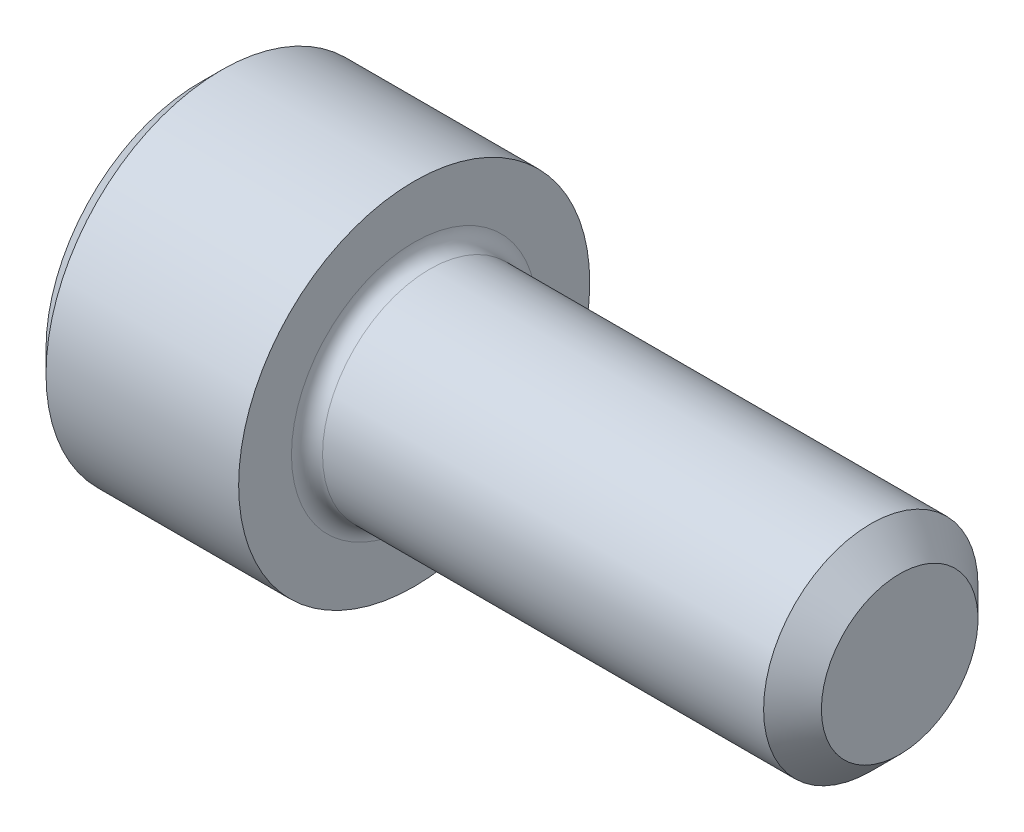
ISO-10303-21;
HEADER;
FILE_DESCRIPTION(('STEP AP214'),'2;1');
FILE_NAME('part.step','',(''),(''),'','','');
FILE_SCHEMA(('AUTOMOTIVE_DESIGN { 1 0 10303 214 1 1 1 1 }'));
ENDSEC;
DATA;
#1=APPLICATION_CONTEXT('core data for automotive mechanical design processes');
#2=APPLICATION_PROTOCOL_DEFINITION('international standard','automotive_design',2000,#1);
#3=PRODUCT_CONTEXT('',#1,'mechanical');
#4=PRODUCT('Part','Part','',(#3));
#5=PRODUCT_RELATED_PRODUCT_CATEGORY('part','',(#4));
#6=PRODUCT_DEFINITION_FORMATION('','',#4);
#7=PRODUCT_DEFINITION_CONTEXT('part definition',#1,'design');
#8=PRODUCT_DEFINITION('design','',#6,#7);
#9=PRODUCT_DEFINITION_SHAPE('','',#8);
#10=(LENGTH_UNIT() NAMED_UNIT(*) SI_UNIT(.MILLI.,.METRE.));
#11=(NAMED_UNIT(*) PLANE_ANGLE_UNIT() SI_UNIT($,.RADIAN.));
#12=(NAMED_UNIT(*) SI_UNIT($,.STERADIAN.) SOLID_ANGLE_UNIT());
#13=UNCERTAINTY_MEASURE_WITH_UNIT(LENGTH_MEASURE(1.E-05),#10,'distance_accuracy_value','');
#14=(GEOMETRIC_REPRESENTATION_CONTEXT(3) GLOBAL_UNCERTAINTY_ASSIGNED_CONTEXT((#13)) GLOBAL_UNIT_ASSIGNED_CONTEXT((#10,
#11,#12)) REPRESENTATION_CONTEXT('',''));
#15=CARTESIAN_POINT('',(0.,0.,0.));
#16=DIRECTION('',(0.,0.,1.));
#17=DIRECTION('',(1.,0.,0.));
#18=AXIS2_PLACEMENT_3D('',#15,#16,#17);
#19=CARTESIAN_POINT('',(0.,0.,0.));
#20=DIRECTION('',(-1.,0.,0.));
#21=DIRECTION('',(0.,0.,1.));
#22=AXIS2_PLACEMENT_3D('',#19,#20,#21);
#23=PLANE('',#22);
#24=DIRECTION('',(0.,-0.499999999999999,0.866025403784439));
#25=VECTOR('',#24,1.);
#26=CARTESIAN_POINT('',(0.,1.5984519552784,0.));
#27=LINE('',#26,#25);
#28=CARTESIAN_POINT('',(0.,1.5984519552784,0.));
#29=VERTEX_POINT('',#28);
#30=CARTESIAN_POINT('',(0.,0.799225977639205,1.3843));
#31=VERTEX_POINT('',#30);
#32=EDGE_CURVE('E257',#29,#31,#27,.T.);
#33=ORIENTED_EDGE('',*,*,#32,.T.);
#34=DIRECTION('',(0.,1.,0.));
#35=VECTOR('',#34,1.);
#36=CARTESIAN_POINT('',(0.,-0.799225977639191,1.3843));
#37=LINE('',#36,#35);
#38=CARTESIAN_POINT('',(0.,-0.799225977639191,1.3843));
#39=VERTEX_POINT('',#38);
#40=EDGE_CURVE('E128',#39,#31,#37,.T.);
#41=ORIENTED_EDGE('',*,*,#40,.F.);
#42=DIRECTION('',(0.,-0.500000000000001,-0.866025403784438));
#43=VECTOR('',#42,1.);
#44=CARTESIAN_POINT('',(0.,-0.799225977639191,1.3843));
#45=LINE('',#44,#43);
#46=CARTESIAN_POINT('',(0.,-1.59845195527839,0.));
#47=VERTEX_POINT('',#46);
#48=EDGE_CURVE('E260',#39,#47,#45,.T.);
#49=ORIENTED_EDGE('',*,*,#48,.T.);
#50=DIRECTION('',(0.,0.499999999999999,-0.86602540378444));
#51=VECTOR('',#50,1.);
#52=CARTESIAN_POINT('',(0.,-1.59845195527839,0.));
#53=LINE('',#52,#51);
#54=CARTESIAN_POINT('',(0.,-0.799225977639196,-1.3843));
#55=VERTEX_POINT('',#54);
#56=EDGE_CURVE('E263',#47,#55,#53,.T.);
#57=ORIENTED_EDGE('',*,*,#56,.T.);
#58=DIRECTION('',(0.,-1.,0.));
#59=VECTOR('',#58,1.);
#60=CARTESIAN_POINT('',(0.,0.799225977639202,-1.3843));
#61=LINE('',#60,#59);
#62=CARTESIAN_POINT('',(0.,0.799225977639202,-1.3843));
#63=VERTEX_POINT('',#62);
#64=EDGE_CURVE('E266',#63,#55,#61,.T.);
#65=ORIENTED_EDGE('',*,*,#64,.F.);
#66=DIRECTION('',(0.,-0.500000000000001,-0.866025403784438));
#67=VECTOR('',#66,1.);
#68=CARTESIAN_POINT('',(0.,1.5984519552784,0.));
#69=LINE('',#68,#67);
#70=EDGE_CURVE('E123',#29,#63,#69,.T.);
#71=ORIENTED_EDGE('',*,*,#70,.F.);
#72=EDGE_LOOP('',(#33,#41,#49,#57,#65,#71));
#73=FACE_BOUND('',#72,.T.);
#74=CARTESIAN_POINT('',(0.,0.,0.));
#75=DIRECTION('',(-1.,0.,0.));
#76=DIRECTION('',(0.,0.,1.));
#77=AXIS2_PLACEMENT_3D('',#74,#75,#76);
#78=CIRCLE('',#77,2.51460000000001);
#79=CARTESIAN_POINT('',(0.,0.,2.51460000000001));
#80=VERTEX_POINT('',#79);
#81=EDGE_CURVE('E152',#80,#80,#78,.T.);
#82=ORIENTED_EDGE('',*,*,#81,.T.);
#83=EDGE_LOOP('',(#82));
#84=FACE_BOUND('',#83,.T.);
#85=ADVANCED_FACE('F32',(#73,#84),#23,.T.);
#86=CARTESIAN_POINT('',(0.,0.,0.));
#87=DIRECTION('',(1.,0.,0.));
#88=DIRECTION('',(0.,0.,-1.));
#89=AXIS2_PLACEMENT_3D('',#86,#87,#88);
#90=CONICAL_SURFACE('',#89,2.51460000000001,0.785398163397436);
#91=CARTESIAN_POINT('',(0.355600000000005,0.,0.));
#92=DIRECTION('',(-1.,0.,0.));
#93=DIRECTION('',(0.,0.,1.));
#94=AXIS2_PLACEMENT_3D('',#91,#92,#93);
#95=CIRCLE('',#94,2.8702);
#96=CARTESIAN_POINT('',(0.355600000000005,0.,2.8702));
#97=VERTEX_POINT('',#96);
#98=EDGE_CURVE('E149',#97,#97,#95,.T.);
#99=ORIENTED_EDGE('',*,*,#98,.T.);
#100=EDGE_LOOP('',(#99));
#101=FACE_BOUND('',#100,.T.);
#102=ORIENTED_EDGE('',*,*,#81,.F.);
#103=EDGE_LOOP('',(#102));
#104=FACE_BOUND('',#103,.T.);
#105=ADVANCED_FACE('F173',(#101,#104),#90,.T.);
#106=CARTESIAN_POINT('',(-31.75,0.,0.));
#107=DIRECTION('',(-1.,0.,0.));
#108=DIRECTION('',(0.,0.,1.));
#109=AXIS2_PLACEMENT_3D('',#106,#107,#108);
#110=CYLINDRICAL_SURFACE('',#109,2.8702);
#111=CARTESIAN_POINT('',(3.5052,0.,0.));
#112=DIRECTION('',(-1.,0.,0.));
#113=DIRECTION('',(0.,0.,1.));
#114=AXIS2_PLACEMENT_3D('',#111,#112,#113);
#115=CIRCLE('',#114,2.8702);
#116=CARTESIAN_POINT('',(3.5052,0.,2.8702));
#117=VERTEX_POINT('',#116);
#118=EDGE_CURVE('E146',#117,#117,#115,.T.);
#119=ORIENTED_EDGE('',*,*,#118,.T.);
#120=EDGE_LOOP('',(#119));
#121=FACE_BOUND('',#120,.T.);
#122=ORIENTED_EDGE('',*,*,#98,.F.);
#123=EDGE_LOOP('',(#122));
#124=FACE_BOUND('',#123,.T.);
#125=ADVANCED_FACE('F178',(#121,#124),#110,.T.);
#126=CARTESIAN_POINT('',(3.5052,2.8702,0.));
#127=DIRECTION('',(1.,0.,0.));
#128=DIRECTION('',(0.,0.,-1.));
#129=AXIS2_PLACEMENT_3D('',#126,#127,#128);
#130=PLANE('',#129);
#131=CARTESIAN_POINT('',(3.5052,0.,0.));
#132=DIRECTION('',(1.,0.,0.));
#133=DIRECTION('',(0.,0.,-1.));
#134=AXIS2_PLACEMENT_3D('',#131,#132,#133);
#135=CIRCLE('',#134,2.0066);
#136=CARTESIAN_POINT('',(3.5052,0.,-2.0066));
#137=VERTEX_POINT('',#136);
#138=EDGE_CURVE('E40',#137,#137,#135,.F.);
#139=ORIENTED_EDGE('',*,*,#138,.T.);
#140=EDGE_LOOP('',(#139));
#141=FACE_BOUND('',#140,.T.);
#142=ORIENTED_EDGE('',*,*,#118,.F.);
#143=EDGE_LOOP('',(#142));
#144=FACE_BOUND('',#143,.T.);
#145=ADVANCED_FACE('F157',(#141,#144),#130,.T.);
#146=CARTESIAN_POINT('',(-31.75,0.,0.));
#147=DIRECTION('',(-1.,0.,0.));
#148=DIRECTION('',(0.,0.,1.));
#149=AXIS2_PLACEMENT_3D('',#146,#147,#148);
#150=CYLINDRICAL_SURFACE('',#149,1.7526);
#151=CARTESIAN_POINT('',(3.7592,0.,0.));
#152=DIRECTION('',(1.,0.,0.));
#153=DIRECTION('',(0.,0.,-1.));
#154=AXIS2_PLACEMENT_3D('',#151,#152,#153);
#155=CIRCLE('',#154,1.7526);
#156=CARTESIAN_POINT('',(3.7592,0.,-1.7526));
#157=VERTEX_POINT('',#156);
#158=EDGE_CURVE('E11',#157,#157,#155,.T.);
#159=ORIENTED_EDGE('',*,*,#158,.T.);
#160=EDGE_LOOP('',(#159));
#161=FACE_BOUND('',#160,.T.);
#162=CARTESIAN_POINT('',(10.97026,0.,0.));
#163=DIRECTION('',(-1.,0.,0.));
#164=DIRECTION('',(0.,0.,1.));
#165=AXIS2_PLACEMENT_3D('',#162,#163,#164);
#166=CIRCLE('',#165,1.7526);
#167=CARTESIAN_POINT('',(10.97026,0.,1.7526));
#168=VERTEX_POINT('',#167);
#169=EDGE_CURVE('E143',#168,#168,#166,.T.);
#170=ORIENTED_EDGE('',*,*,#169,.T.);
#171=EDGE_LOOP('',(#170));
#172=FACE_BOUND('',#171,.T.);
#173=ADVANCED_FACE('F188',(#161,#172),#150,.T.);
#174=CARTESIAN_POINT('',(11.4427,0.,0.));
#175=DIRECTION('',(-1.,0.,0.));
#176=DIRECTION('',(0.,0.,1.));
#177=AXIS2_PLACEMENT_3D('',#174,#175,#176);
#178=CONICAL_SURFACE('',#177,1.28016,0.785398163397457);
#179=ORIENTED_EDGE('',*,*,#169,.F.);
#180=EDGE_LOOP('',(#179));
#181=FACE_BOUND('',#180,.T.);
#182=CARTESIAN_POINT('',(11.4427,0.,0.));
#183=DIRECTION('',(-1.,0.,0.));
#184=DIRECTION('',(0.,0.,1.));
#185=AXIS2_PLACEMENT_3D('',#182,#183,#184);
#186=CIRCLE('',#185,1.28016);
#187=CARTESIAN_POINT('',(11.4427,0.,1.28016));
#188=VERTEX_POINT('',#187);
#189=EDGE_CURVE('E139',#188,#188,#186,.T.);
#190=ORIENTED_EDGE('',*,*,#189,.T.);
#191=EDGE_LOOP('',(#190));
#192=FACE_BOUND('',#191,.T.);
#193=ADVANCED_FACE('F168',(#181,#192),#178,.T.);
#194=CARTESIAN_POINT('',(11.4427,1.28016,0.));
#195=DIRECTION('',(1.,0.,0.));
#196=DIRECTION('',(0.,0.,-1.));
#197=AXIS2_PLACEMENT_3D('',#194,#195,#196);
#198=PLANE('',#197);
#199=ORIENTED_EDGE('',*,*,#189,.F.);
#200=EDGE_LOOP('',(#199));
#201=FACE_BOUND('',#200,.T.);
#202=ADVANCED_FACE('F161',(#201),#198,.T.);
#203=CARTESIAN_POINT('',(3.7592,0.,0.));
#204=DIRECTION('',(1.,0.,0.));
#205=DIRECTION('',(0.,0.,-1.));
#206=AXIS2_PLACEMENT_3D('',#203,#204,#205);
#207=TOROIDAL_SURFACE('',#206,2.0066,0.254);
#208=ORIENTED_EDGE('',*,*,#158,.F.);
#209=EDGE_LOOP('',(#208));
#210=FACE_BOUND('',#209,.T.);
#211=ORIENTED_EDGE('',*,*,#138,.F.);
#212=EDGE_LOOP('',(#211));
#213=FACE_BOUND('',#212,.T.);
#214=ADVANCED_FACE('F34',(#210,#213),#207,.F.);
#215=CARTESIAN_POINT('',(1.6256,1.5984519552784,0.));
#216=DIRECTION('',(0.,-0.866025403784439,-0.499999999999999));
#217=DIRECTION('',(0.,0.499999999999999,-0.866025403784439));
#218=AXIS2_PLACEMENT_3D('',#215,#216,#217);
#219=PLANE('',#218);
#220=ORIENTED_EDGE('',*,*,#32,.F.);
#221=DIRECTION('',(-1.,0.,0.));
#222=VECTOR('',#221,1.);
#223=CARTESIAN_POINT('',(1.6256,1.5984519552784,0.));
#224=LINE('',#223,#222);
#225=CARTESIAN_POINT('',(1.6256,1.5984519552784,0.));
#226=VERTEX_POINT('',#225);
#227=EDGE_CURVE('E247',#226,#29,#224,.T.);
#228=ORIENTED_EDGE('',*,*,#227,.F.);
#229=DIRECTION('',(0.,-0.499999999999999,0.866025403784439));
#230=VECTOR('',#229,1.);
#231=CARTESIAN_POINT('',(1.6256,1.5984519552784,0.));
#232=LINE('',#231,#230);
#233=CARTESIAN_POINT('',(1.6256,1.1988389664588,0.692150000000001));
#234=VERTEX_POINT('',#233);
#235=EDGE_CURVE('E115',#226,#234,#232,.T.);
#236=ORIENTED_EDGE('',*,*,#235,.T.);
#237=CARTESIAN_POINT('',(1.6256,0.799225977639205,1.3843));
#238=VERTEX_POINT('',#237);
#239=EDGE_CURVE('E106',#234,#238,#232,.T.);
#240=ORIENTED_EDGE('',*,*,#239,.T.);
#241=DIRECTION('',(-1.,0.,0.));
#242=VECTOR('',#241,1.);
#243=CARTESIAN_POINT('',(1.6256,0.799225977639205,1.3843));
#244=LINE('',#243,#242);
#245=EDGE_CURVE('E120',#238,#31,#244,.T.);
#246=ORIENTED_EDGE('',*,*,#245,.T.);
#247=EDGE_LOOP('',(#220,#228,#236,#240,#246));
#248=FACE_BOUND('',#247,.T.);
#249=ADVANCED_FACE('F119',(#248),#219,.T.);
#250=CARTESIAN_POINT('',(1.6256,-0.799225977639191,1.3843));
#251=DIRECTION('',(0.,0.,1.));
#252=DIRECTION('',(0.,-1.,0.));
#253=AXIS2_PLACEMENT_3D('',#250,#251,#252);
#254=PLANE('',#253);
#255=ORIENTED_EDGE('',*,*,#40,.T.);
#256=ORIENTED_EDGE('',*,*,#245,.F.);
#257=DIRECTION('',(0.,1.,0.));
#258=VECTOR('',#257,1.);
#259=CARTESIAN_POINT('',(1.6256,-0.799225977639191,1.3843));
#260=LINE('',#259,#258);
#261=CARTESIAN_POINT('',(1.6256,0.,1.3843));
#262=VERTEX_POINT('',#261);
#263=EDGE_CURVE('E103',#262,#238,#260,.T.);
#264=ORIENTED_EDGE('',*,*,#263,.F.);
#265=CARTESIAN_POINT('',(1.6256,-0.799225977639191,1.3843));
#266=VERTEX_POINT('',#265);
#267=EDGE_CURVE('E114',#266,#262,#260,.T.);
#268=ORIENTED_EDGE('',*,*,#267,.F.);
#269=DIRECTION('',(-1.,0.,0.));
#270=VECTOR('',#269,1.);
#271=CARTESIAN_POINT('',(1.6256,-0.799225977639191,1.3843));
#272=LINE('',#271,#270);
#273=EDGE_CURVE('E130',#266,#39,#272,.T.);
#274=ORIENTED_EDGE('',*,*,#273,.T.);
#275=EDGE_LOOP('',(#255,#256,#264,#268,#274));
#276=FACE_BOUND('',#275,.T.);
#277=ADVANCED_FACE('F125',(#276),#254,.F.);
#278=CARTESIAN_POINT('',(1.6256,-0.799225977639191,1.3843));
#279=DIRECTION('',(0.,0.866025403784438,-0.500000000000001));
#280=DIRECTION('',(0.,0.500000000000001,0.866025403784438));
#281=AXIS2_PLACEMENT_3D('',#278,#279,#280);
#282=PLANE('',#281);
#283=ORIENTED_EDGE('',*,*,#48,.F.);
#284=ORIENTED_EDGE('',*,*,#273,.F.);
#285=DIRECTION('',(0.,-0.500000000000001,-0.866025403784438));
#286=VECTOR('',#285,1.);
#287=CARTESIAN_POINT('',(1.6256,-0.799225977639191,1.3843));
#288=LINE('',#287,#286);
#289=CARTESIAN_POINT('',(1.6256,-1.19883896645879,0.692149999999999));
#290=VERTEX_POINT('',#289);
#291=EDGE_CURVE('E286',#266,#290,#288,.T.);
#292=ORIENTED_EDGE('',*,*,#291,.T.);
#293=CARTESIAN_POINT('',(1.6256,-1.59845195527839,0.));
#294=VERTEX_POINT('',#293);
#295=EDGE_CURVE('E275',#290,#294,#288,.T.);
#296=ORIENTED_EDGE('',*,*,#295,.T.);
#297=DIRECTION('',(-1.,0.,0.));
#298=VECTOR('',#297,1.);
#299=CARTESIAN_POINT('',(1.6256,-1.59845195527839,0.));
#300=LINE('',#299,#298);
#301=EDGE_CURVE('E135',#294,#47,#300,.T.);
#302=ORIENTED_EDGE('',*,*,#301,.T.);
#303=EDGE_LOOP('',(#283,#284,#292,#296,#302));
#304=FACE_BOUND('',#303,.T.);
#305=ADVANCED_FACE('F201',(#304),#282,.T.);
#306=CARTESIAN_POINT('',(1.6256,-1.59845195527839,0.));
#307=DIRECTION('',(0.,0.866025403784439,0.499999999999999));
#308=DIRECTION('',(0.,-0.499999999999999,0.866025403784439));
#309=AXIS2_PLACEMENT_3D('',#306,#307,#308);
#310=PLANE('',#309);
#311=ORIENTED_EDGE('',*,*,#56,.F.);
#312=ORIENTED_EDGE('',*,*,#301,.F.);
#313=DIRECTION('',(0.,0.499999999999999,-0.86602540378444));
#314=VECTOR('',#313,1.);
#315=CARTESIAN_POINT('',(1.6256,-1.59845195527839,0.));
#316=LINE('',#315,#314);
#317=CARTESIAN_POINT('',(1.6256,-1.1988389664588,-0.692149999999996));
#318=VERTEX_POINT('',#317);
#319=EDGE_CURVE('E253',#294,#318,#316,.T.);
#320=ORIENTED_EDGE('',*,*,#319,.T.);
#321=CARTESIAN_POINT('',(1.6256,-0.799225977639196,-1.3843));
#322=VERTEX_POINT('',#321);
#323=EDGE_CURVE('E285',#318,#322,#316,.T.);
#324=ORIENTED_EDGE('',*,*,#323,.T.);
#325=DIRECTION('',(-1.,0.,0.));
#326=VECTOR('',#325,1.);
#327=CARTESIAN_POINT('',(1.6256,-0.799225977639196,-1.3843));
#328=LINE('',#327,#326);
#329=EDGE_CURVE('E246',#322,#55,#328,.T.);
#330=ORIENTED_EDGE('',*,*,#329,.T.);
#331=EDGE_LOOP('',(#311,#312,#320,#324,#330));
#332=FACE_BOUND('',#331,.T.);
#333=ADVANCED_FACE('F204',(#332),#310,.T.);
#334=CARTESIAN_POINT('',(1.6256,0.799225977639202,-1.3843));
#335=DIRECTION('',(0.,0.,-1.));
#336=DIRECTION('',(0.,1.,0.));
#337=AXIS2_PLACEMENT_3D('',#334,#335,#336);
#338=PLANE('',#337);
#339=ORIENTED_EDGE('',*,*,#64,.T.);
#340=ORIENTED_EDGE('',*,*,#329,.F.);
#341=DIRECTION('',(0.,-1.,0.));
#342=VECTOR('',#341,1.);
#343=CARTESIAN_POINT('',(1.6256,0.799225977639202,-1.3843));
#344=LINE('',#343,#342);
#345=CARTESIAN_POINT('',(1.6256,0.,-1.3843));
#346=VERTEX_POINT('',#345);
#347=EDGE_CURVE('E250',#346,#322,#344,.T.);
#348=ORIENTED_EDGE('',*,*,#347,.F.);
#349=CARTESIAN_POINT('',(1.6256,0.799225977639202,-1.3843));
#350=VERTEX_POINT('',#349);
#351=EDGE_CURVE('E47',#350,#346,#344,.T.);
#352=ORIENTED_EDGE('',*,*,#351,.F.);
#353=DIRECTION('',(-1.,0.,0.));
#354=VECTOR('',#353,1.);
#355=CARTESIAN_POINT('',(1.6256,0.799225977639202,-1.3843));
#356=LINE('',#355,#354);
#357=EDGE_CURVE('E243',#350,#63,#356,.T.);
#358=ORIENTED_EDGE('',*,*,#357,.T.);
#359=EDGE_LOOP('',(#339,#340,#348,#352,#358));
#360=FACE_BOUND('',#359,.T.);
#361=ADVANCED_FACE('F208',(#360),#338,.F.);
#362=CARTESIAN_POINT('',(1.6256,1.5984519552784,0.));
#363=DIRECTION('',(0.,0.866025403784438,-0.500000000000001));
#364=DIRECTION('',(0.,0.500000000000001,0.866025403784438));
#365=AXIS2_PLACEMENT_3D('',#362,#363,#364);
#366=PLANE('',#365);
#367=ORIENTED_EDGE('',*,*,#70,.T.);
#368=ORIENTED_EDGE('',*,*,#357,.F.);
#369=DIRECTION('',(0.,-0.500000000000001,-0.866025403784438));
#370=VECTOR('',#369,1.);
#371=CARTESIAN_POINT('',(1.6256,1.5984519552784,0.));
#372=LINE('',#371,#370);
#373=CARTESIAN_POINT('',(1.6256,1.1988389664588,-0.692150000000004));
#374=VERTEX_POINT('',#373);
#375=EDGE_CURVE('E233',#374,#350,#372,.T.);
#376=ORIENTED_EDGE('',*,*,#375,.F.);
#377=EDGE_CURVE('E239',#226,#374,#372,.T.);
#378=ORIENTED_EDGE('',*,*,#377,.F.);
#379=ORIENTED_EDGE('',*,*,#227,.T.);
#380=EDGE_LOOP('',(#367,#368,#376,#378,#379));
#381=FACE_BOUND('',#380,.T.);
#382=ADVANCED_FACE('F212',(#381),#366,.F.);
#383=CARTESIAN_POINT('',(1.6256,0.,2.7686));
#384=DIRECTION('',(1.,0.,0.));
#385=DIRECTION('',(0.,0.,-1.));
#386=AXIS2_PLACEMENT_3D('',#383,#384,#385);
#387=PLANE('',#386);
#388=ORIENTED_EDGE('',*,*,#347,.T.);
#389=ORIENTED_EDGE('',*,*,#323,.F.);
#390=CARTESIAN_POINT('',(1.6256,0.,0.));
#391=DIRECTION('',(-1.,0.,0.));
#392=DIRECTION('',(0.,0.,1.));
#393=AXIS2_PLACEMENT_3D('',#390,#391,#392);
#394=CIRCLE('',#393,1.3843);
#395=EDGE_CURVE('E281',#346,#318,#394,.T.);
#396=ORIENTED_EDGE('',*,*,#395,.F.);
#397=EDGE_LOOP('',(#388,#389,#396));
#398=FACE_BOUND('',#397,.T.);
#399=ADVANCED_FACE('F216',(#398),#387,.F.);
#400=ORIENTED_EDGE('',*,*,#319,.F.);
#401=ORIENTED_EDGE('',*,*,#295,.F.);
#402=EDGE_CURVE('E133',#318,#290,#394,.T.);
#403=ORIENTED_EDGE('',*,*,#402,.F.);
#404=EDGE_LOOP('',(#400,#401,#403));
#405=FACE_BOUND('',#404,.T.);
#406=ADVANCED_FACE('F219',(#405),#387,.F.);
#407=ORIENTED_EDGE('',*,*,#291,.F.);
#408=ORIENTED_EDGE('',*,*,#267,.T.);
#409=EDGE_CURVE('E129',#290,#262,#394,.T.);
#410=ORIENTED_EDGE('',*,*,#409,.F.);
#411=EDGE_LOOP('',(#407,#408,#410));
#412=FACE_BOUND('',#411,.T.);
#413=ADVANCED_FACE('F224',(#412),#387,.F.);
#414=ORIENTED_EDGE('',*,*,#263,.T.);
#415=ORIENTED_EDGE('',*,*,#239,.F.);
#416=EDGE_CURVE('E109',#262,#234,#394,.T.);
#417=ORIENTED_EDGE('',*,*,#416,.F.);
#418=EDGE_LOOP('',(#414,#415,#417));
#419=FACE_BOUND('',#418,.T.);
#420=ADVANCED_FACE('F105',(#419),#387,.F.);
#421=ORIENTED_EDGE('',*,*,#235,.F.);
#422=ORIENTED_EDGE('',*,*,#377,.T.);
#423=EDGE_CURVE('E140',#234,#374,#394,.T.);
#424=ORIENTED_EDGE('',*,*,#423,.F.);
#425=EDGE_LOOP('',(#421,#422,#424));
#426=FACE_BOUND('',#425,.T.);
#427=ADVANCED_FACE('F227',(#426),#387,.F.);
#428=ORIENTED_EDGE('',*,*,#375,.T.);
#429=ORIENTED_EDGE('',*,*,#351,.T.);
#430=EDGE_CURVE('E236',#374,#346,#394,.T.);
#431=ORIENTED_EDGE('',*,*,#430,.F.);
#432=EDGE_LOOP('',(#428,#429,#431));
#433=FACE_BOUND('',#432,.T.);
#434=ADVANCED_FACE('F197',(#433),#387,.F.);
#435=CARTESIAN_POINT('',(1.6256,0.,0.));
#436=DIRECTION('',(-1.,0.,0.));
#437=DIRECTION('',(0.,0.,1.));
#438=AXIS2_PLACEMENT_3D('',#435,#436,#437);
#439=CONICAL_SURFACE('',#438,1.3843,1.04719755119659);
#440=CARTESIAN_POINT('',(2.4248259776392,0.,0.));
#441=VERTEX_POINT('',#440);
#442=VERTEX_LOOP('',#441);
#443=FACE_BOUND('',#442,.T.);
#444=ORIENTED_EDGE('',*,*,#416,.T.);
#445=ORIENTED_EDGE('',*,*,#423,.T.);
#446=ORIENTED_EDGE('',*,*,#430,.T.);
#447=ORIENTED_EDGE('',*,*,#395,.T.);
#448=ORIENTED_EDGE('',*,*,#402,.T.);
#449=ORIENTED_EDGE('',*,*,#409,.T.);
#450=EDGE_LOOP('',(#444,#445,#446,#447,#448,#449));
#451=FACE_BOUND('',#450,.T.);
#452=ADVANCED_FACE('F195',(#443,#451),#439,.F.);
#453=CLOSED_SHELL('',(#85,#105,#125,#145,#173,#193,#202,#214,#249,#277,#305,#333,#361,#382,#399,
#406,#413,#420,#427,#434,#452));
#454=MANIFOLD_SOLID_BREP('B2',#453);
#455=ADVANCED_BREP_SHAPE_REPRESENTATION('',(#18,#454),#14);
#456=SHAPE_DEFINITION_REPRESENTATION(#9,#455);
ENDSEC;
END-ISO-10303-21;
